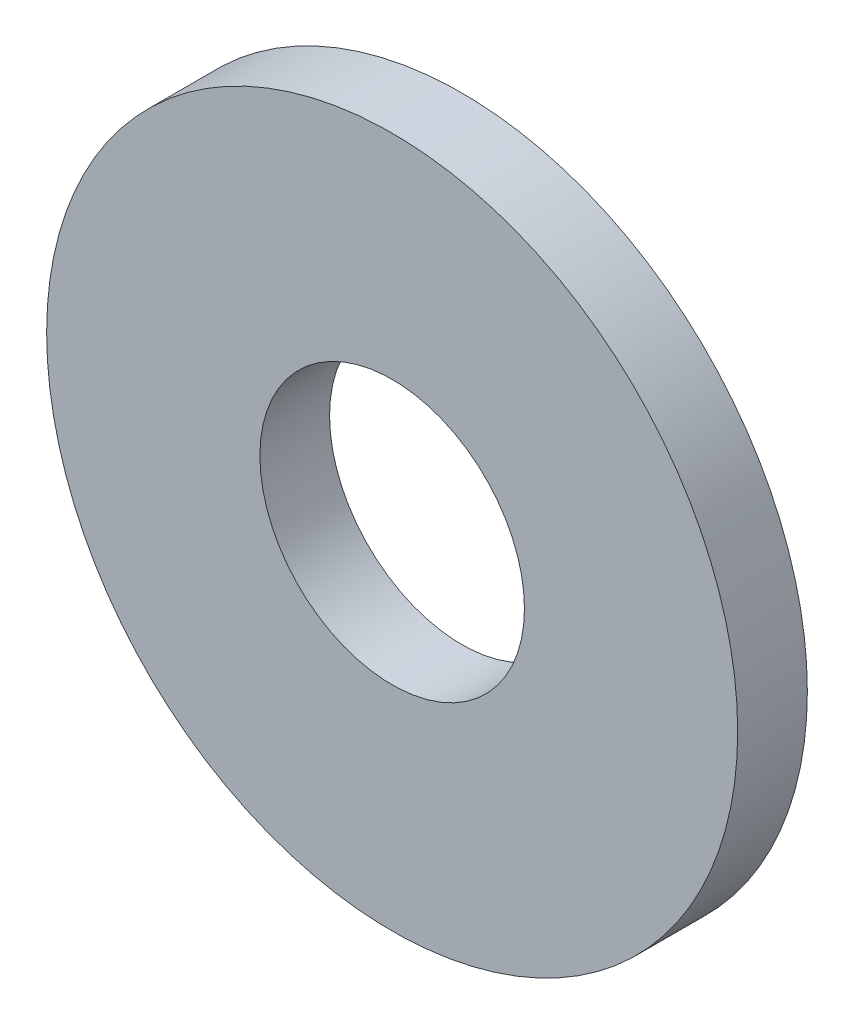
ISO-10303-21;
HEADER;
FILE_DESCRIPTION(('STEP AP214'),'2;1');
FILE_NAME('part.step','',(''),(''),'','','');
FILE_SCHEMA(('AUTOMOTIVE_DESIGN { 1 0 10303 214 1 1 1 1 }'));
ENDSEC;
DATA;
#1=APPLICATION_CONTEXT('core data for automotive mechanical design processes');
#2=APPLICATION_PROTOCOL_DEFINITION('international standard','automotive_design',2000,#1);
#3=PRODUCT_CONTEXT('',#1,'mechanical');
#4=PRODUCT('Part','Part','',(#3));
#5=PRODUCT_RELATED_PRODUCT_CATEGORY('part','',(#4));
#6=PRODUCT_DEFINITION_FORMATION('','',#4);
#7=PRODUCT_DEFINITION_CONTEXT('part definition',#1,'design');
#8=PRODUCT_DEFINITION('design','',#6,#7);
#9=PRODUCT_DEFINITION_SHAPE('','',#8);
#10=(LENGTH_UNIT() NAMED_UNIT(*) SI_UNIT(.MILLI.,.METRE.));
#11=(NAMED_UNIT(*) PLANE_ANGLE_UNIT() SI_UNIT($,.RADIAN.));
#12=(NAMED_UNIT(*) SI_UNIT($,.STERADIAN.) SOLID_ANGLE_UNIT());
#13=UNCERTAINTY_MEASURE_WITH_UNIT(LENGTH_MEASURE(1.E-05),#10,'distance_accuracy_value','');
#14=(GEOMETRIC_REPRESENTATION_CONTEXT(3) GLOBAL_UNCERTAINTY_ASSIGNED_CONTEXT((#13)) GLOBAL_UNIT_ASSIGNED_CONTEXT((#10,
#11,#12)) REPRESENTATION_CONTEXT('',''));
#15=CARTESIAN_POINT('',(0.,0.,0.));
#16=DIRECTION('',(0.,0.,1.));
#17=DIRECTION('',(1.,0.,0.));
#18=AXIS2_PLACEMENT_3D('',#15,#16,#17);
#19=CARTESIAN_POINT('',(0.,0.,0.939799999999998));
#20=DIRECTION('',(0.,0.,1.));
#21=DIRECTION('',(1.,0.,0.));
#22=AXIS2_PLACEMENT_3D('',#19,#20,#21);
#23=PLANE('',#22);
#24=CARTESIAN_POINT('',(0.,0.,0.939799999999998));
#25=DIRECTION('',(0.,0.,1.));
#26=DIRECTION('',(1.,0.,0.));
#27=AXIS2_PLACEMENT_3D('',#24,#25,#26);
#28=CIRCLE('',#27,9.3218);
#29=CARTESIAN_POINT('',(-9.3218,0.,0.939799999999998));
#30=VERTEX_POINT('',#29);
#31=EDGE_CURVE('E10',#30,#30,#28,.T.);
#32=ORIENTED_EDGE('',*,*,#31,.T.);
#33=EDGE_LOOP('',(#32));
#34=FACE_BOUND('',#33,.T.);
#35=CARTESIAN_POINT('',(0.,0.,0.939799999999998));
#36=DIRECTION('',(0.,0.,1.));
#37=DIRECTION('',(1.,0.,0.));
#38=AXIS2_PLACEMENT_3D('',#35,#36,#37);
#39=CIRCLE('',#38,3.5687);
#40=CARTESIAN_POINT('',(-3.5687,0.,0.939799999999998));
#41=VERTEX_POINT('',#40);
#42=EDGE_CURVE('E37',#41,#41,#39,.T.);
#43=ORIENTED_EDGE('',*,*,#42,.F.);
#44=EDGE_LOOP('',(#43));
#45=FACE_BOUND('',#44,.T.);
#46=ADVANCED_FACE('F30',(#34,#45),#23,.T.);
#47=CARTESIAN_POINT('',(0.,0.,0.939799999999998));
#48=DIRECTION('',(0.,0.,-1.));
#49=DIRECTION('',(-1.,0.,0.));
#50=AXIS2_PLACEMENT_3D('',#47,#48,#49);
#51=CYLINDRICAL_SURFACE('',#50,9.3218);
#52=CARTESIAN_POINT('',(0.,0.,-0.939800000000002));
#53=DIRECTION('',(0.,0.,1.));
#54=DIRECTION('',(1.,0.,0.));
#55=AXIS2_PLACEMENT_3D('',#52,#53,#54);
#56=CIRCLE('',#55,9.3218);
#57=CARTESIAN_POINT('',(-9.3218,0.,-0.939800000000002));
#58=VERTEX_POINT('',#57);
#59=EDGE_CURVE('E41',#58,#58,#56,.T.);
#60=CARTESIAN_POINT('',(-9.3218,0.,0.939799999999998));
#61=CARTESIAN_POINT('',(-9.3218,0.,0.920220833333331));
#62=CARTESIAN_POINT('',(-9.3218,0.,0.900641666666665));
#63=CARTESIAN_POINT('',(-9.3218,0.,0.861483333333332));
#64=CARTESIAN_POINT('',(-9.3218,0.,0.841904166666665));
#65=CARTESIAN_POINT('',(-9.3218,0.,0.802745833333331));
#66=CARTESIAN_POINT('',(-9.3218,0.,0.783166666666665));
#67=CARTESIAN_POINT('',(-9.3218,0.,0.744008333333331));
#68=CARTESIAN_POINT('',(-9.3218,0.,0.724429166666665));
#69=CARTESIAN_POINT('',(-9.3218,0.,0.685270833333331));
#70=CARTESIAN_POINT('',(-9.3218,0.,0.665691666666665));
#71=CARTESIAN_POINT('',(-9.3218,0.,0.626533333333331));
#72=CARTESIAN_POINT('',(-9.3218,0.,0.606954166666665));
#73=CARTESIAN_POINT('',(-9.3218,0.,0.567795833333332));
#74=CARTESIAN_POINT('',(-9.3218,0.,0.548216666666665));
#75=CARTESIAN_POINT('',(-9.3218,0.,0.509058333333332));
#76=CARTESIAN_POINT('',(-9.3218,0.,0.489479166666665));
#77=CARTESIAN_POINT('',(-9.3218,0.,0.450320833333331));
#78=CARTESIAN_POINT('',(-9.3218,0.,0.430741666666665));
#79=CARTESIAN_POINT('',(-9.3218,0.,0.391583333333332));
#80=CARTESIAN_POINT('',(-9.3218,0.,0.372004166666665));
#81=CARTESIAN_POINT('',(-9.3218,0.,0.332845833333332));
#82=CARTESIAN_POINT('',(-9.3218,0.,0.313266666666665));
#83=CARTESIAN_POINT('',(-9.3218,0.,0.274108333333332));
#84=CARTESIAN_POINT('',(-9.3218,0.,0.254529166666665));
#85=CARTESIAN_POINT('',(-9.3218,0.,0.215370833333332));
#86=CARTESIAN_POINT('',(-9.3218,0.,0.195791666666665));
#87=CARTESIAN_POINT('',(-9.3218,0.,0.156633333333331));
#88=CARTESIAN_POINT('',(-9.3218,0.,0.137054166666665));
#89=CARTESIAN_POINT('',(-9.3218,0.,0.0978958333333315));
#90=CARTESIAN_POINT('',(-9.3218,0.,0.0783166666666649));
#91=CARTESIAN_POINT('',(-9.3218,0.,0.0391583333333315));
#92=CARTESIAN_POINT('',(-9.3218,0.,0.0195791666666648));
#93=CARTESIAN_POINT('',(-9.3218,0.,-0.0195791666666685));
#94=CARTESIAN_POINT('',(-9.3218,0.,-0.0391583333333351));
#95=CARTESIAN_POINT('',(-9.3218,0.,-0.0783166666666685));
#96=CARTESIAN_POINT('',(-9.3218,0.,-0.0978958333333352));
#97=CARTESIAN_POINT('',(-9.3218,0.,-0.137054166666668));
#98=CARTESIAN_POINT('',(-9.3218,0.,-0.156633333333335));
#99=CARTESIAN_POINT('',(-9.3218,0.,-0.195791666666668));
#100=CARTESIAN_POINT('',(-9.3218,0.,-0.215370833333335));
#101=CARTESIAN_POINT('',(-9.3218,0.,-0.254529166666668));
#102=CARTESIAN_POINT('',(-9.3218,0.,-0.274108333333335));
#103=CARTESIAN_POINT('',(-9.3218,0.,-0.313266666666668));
#104=CARTESIAN_POINT('',(-9.3218,0.,-0.332845833333335));
#105=CARTESIAN_POINT('',(-9.3218,0.,-0.372004166666668));
#106=CARTESIAN_POINT('',(-9.3218,0.,-0.391583333333335));
#107=CARTESIAN_POINT('',(-9.3218,0.,-0.430741666666668));
#108=CARTESIAN_POINT('',(-9.3218,0.,-0.450320833333335));
#109=CARTESIAN_POINT('',(-9.3218,0.,-0.489479166666669));
#110=CARTESIAN_POINT('',(-9.3218,0.,-0.509058333333335));
#111=CARTESIAN_POINT('',(-9.3218,0.,-0.548216666666669));
#112=CARTESIAN_POINT('',(-9.3218,0.,-0.567795833333335));
#113=CARTESIAN_POINT('',(-9.3218,0.,-0.606954166666669));
#114=CARTESIAN_POINT('',(-9.3218,0.,-0.626533333333335));
#115=CARTESIAN_POINT('',(-9.3218,0.,-0.665691666666669));
#116=CARTESIAN_POINT('',(-9.3218,0.,-0.685270833333335));
#117=CARTESIAN_POINT('',(-9.3218,0.,-0.724429166666669));
#118=CARTESIAN_POINT('',(-9.3218,0.,-0.744008333333335));
#119=CARTESIAN_POINT('',(-9.3218,0.,-0.783166666666669));
#120=CARTESIAN_POINT('',(-9.3218,0.,-0.802745833333335));
#121=CARTESIAN_POINT('',(-9.3218,0.,-0.841904166666669));
#122=CARTESIAN_POINT('',(-9.3218,0.,-0.861483333333335));
#123=CARTESIAN_POINT('',(-9.3218,0.,-0.900641666666669));
#124=CARTESIAN_POINT('',(-9.3218,0.,-0.920220833333335));
#125=CARTESIAN_POINT('',(-9.3218,0.,-0.939800000000002));
#126=B_SPLINE_CURVE_WITH_KNOTS('',3,(#60,#61,#62,#63,#64,#65,#66,#67,#68,#69,#70,#71,#72,#73,
#74,#75,#76,#77,#78,#79,#80,#81,#82,#83,#84,#85,#86,#87,#88,#89,#90,#91,#92,#93,#94,#95,#96,#97,
#98,#99,#100,#101,#102,#103,#104,#105,#106,#107,#108,#109,#110,#111,#112,#113,#114,#115,#116,
#117,#118,#119,#120,#121,#122,#123,#124,#125),.UNSPECIFIED.,.F.,.F.,(4,2,2,2,2,2,2,2,2,2,2,2,2,
2,2,2,2,2,2,2,2,2,2,2,2,2,2,2,2,2,2,2,4),(0.,0.0587375000000001,0.117475,0.1762125,0.23495,
0.2936875,0.352425,0.4111625,0.4699,0.5286375,0.587375,0.6461125,0.70485,0.7635875,0.822325,
0.8810625,0.9398,0.9985375,1.057275,1.1160125,1.17475,1.2334875,1.292225,1.3509625,1.4097,
1.4684375,1.527175,1.5859125,1.64465,1.7033875,1.762125,1.8208625,1.8796),.UNSPECIFIED.);
#127=EDGE_CURVE('BSEAM32',#30,#58,#126,.T.);
#128=ORIENTED_EDGE('',*,*,#31,.F.);
#129=ORIENTED_EDGE('',*,*,#59,.T.);
#130=ORIENTED_EDGE('',*,*,#127,.T.);
#131=ORIENTED_EDGE('',*,*,#127,.F.);
#132=EDGE_LOOP('',(#128,#130,#129,#131));
#133=FACE_BOUND('',#132,.T.);
#134=ADVANCED_FACE('F32',(#133),#51,.T.);
#135=CARTESIAN_POINT('',(0.,0.,0.939799999999998));
#136=DIRECTION('',(0.,0.,-1.));
#137=DIRECTION('',(-1.,0.,0.));
#138=AXIS2_PLACEMENT_3D('',#135,#136,#137);
#139=CYLINDRICAL_SURFACE('',#138,3.5687);
#140=CARTESIAN_POINT('',(0.,0.,-0.939800000000002));
#141=DIRECTION('',(0.,0.,1.));
#142=DIRECTION('',(1.,0.,0.));
#143=AXIS2_PLACEMENT_3D('',#140,#141,#142);
#144=CIRCLE('',#143,3.5687);
#145=CARTESIAN_POINT('',(-3.5687,0.,-0.939800000000002));
#146=VERTEX_POINT('',#145);
#147=EDGE_CURVE('E45',#146,#146,#144,.T.);
#148=CARTESIAN_POINT('',(-3.5687,0.,0.939799999999998));
#149=CARTESIAN_POINT('',(-3.5687,0.,0.920220833333331));
#150=CARTESIAN_POINT('',(-3.5687,0.,0.900641666666665));
#151=CARTESIAN_POINT('',(-3.5687,0.,0.861483333333332));
#152=CARTESIAN_POINT('',(-3.5687,0.,0.841904166666665));
#153=CARTESIAN_POINT('',(-3.5687,0.,0.802745833333331));
#154=CARTESIAN_POINT('',(-3.5687,0.,0.783166666666665));
#155=CARTESIAN_POINT('',(-3.5687,0.,0.744008333333331));
#156=CARTESIAN_POINT('',(-3.5687,0.,0.724429166666665));
#157=CARTESIAN_POINT('',(-3.5687,0.,0.685270833333331));
#158=CARTESIAN_POINT('',(-3.5687,0.,0.665691666666665));
#159=CARTESIAN_POINT('',(-3.5687,0.,0.626533333333331));
#160=CARTESIAN_POINT('',(-3.5687,0.,0.606954166666665));
#161=CARTESIAN_POINT('',(-3.5687,0.,0.567795833333332));
#162=CARTESIAN_POINT('',(-3.5687,0.,0.548216666666665));
#163=CARTESIAN_POINT('',(-3.5687,0.,0.509058333333332));
#164=CARTESIAN_POINT('',(-3.5687,0.,0.489479166666665));
#165=CARTESIAN_POINT('',(-3.5687,0.,0.450320833333331));
#166=CARTESIAN_POINT('',(-3.5687,0.,0.430741666666665));
#167=CARTESIAN_POINT('',(-3.5687,0.,0.391583333333331));
#168=CARTESIAN_POINT('',(-3.5687,0.,0.372004166666665));
#169=CARTESIAN_POINT('',(-3.5687,0.,0.332845833333332));
#170=CARTESIAN_POINT('',(-3.5687,0.,0.313266666666665));
#171=CARTESIAN_POINT('',(-3.5687,0.,0.274108333333331));
#172=CARTESIAN_POINT('',(-3.5687,0.,0.254529166666665));
#173=CARTESIAN_POINT('',(-3.5687,0.,0.215370833333331));
#174=CARTESIAN_POINT('',(-3.5687,0.,0.195791666666665));
#175=CARTESIAN_POINT('',(-3.5687,0.,0.156633333333331));
#176=CARTESIAN_POINT('',(-3.5687,0.,0.137054166666665));
#177=CARTESIAN_POINT('',(-3.5687,0.,0.0978958333333314));
#178=CARTESIAN_POINT('',(-3.5687,0.,0.0783166666666648));
#179=CARTESIAN_POINT('',(-3.5687,0.,0.0391583333333314));
#180=CARTESIAN_POINT('',(-3.5687,0.,0.0195791666666647));
#181=CARTESIAN_POINT('',(-3.5687,0.,-0.0195791666666686));
#182=CARTESIAN_POINT('',(-3.5687,0.,-0.0391583333333352));
#183=CARTESIAN_POINT('',(-3.5687,0.,-0.0783166666666685));
#184=CARTESIAN_POINT('',(-3.5687,0.,-0.0978958333333352));
#185=CARTESIAN_POINT('',(-3.5687,0.,-0.137054166666668));
#186=CARTESIAN_POINT('',(-3.5687,0.,-0.156633333333335));
#187=CARTESIAN_POINT('',(-3.5687,0.,-0.195791666666668));
#188=CARTESIAN_POINT('',(-3.5687,0.,-0.215370833333335));
#189=CARTESIAN_POINT('',(-3.5687,0.,-0.254529166666668));
#190=CARTESIAN_POINT('',(-3.5687,0.,-0.274108333333335));
#191=CARTESIAN_POINT('',(-3.5687,0.,-0.313266666666668));
#192=CARTESIAN_POINT('',(-3.5687,0.,-0.332845833333335));
#193=CARTESIAN_POINT('',(-3.5687,0.,-0.372004166666668));
#194=CARTESIAN_POINT('',(-3.5687,0.,-0.391583333333335));
#195=CARTESIAN_POINT('',(-3.5687,0.,-0.430741666666668));
#196=CARTESIAN_POINT('',(-3.5687,0.,-0.450320833333335));
#197=CARTESIAN_POINT('',(-3.5687,0.,-0.489479166666669));
#198=CARTESIAN_POINT('',(-3.5687,0.,-0.509058333333335));
#199=CARTESIAN_POINT('',(-3.5687,0.,-0.548216666666669));
#200=CARTESIAN_POINT('',(-3.5687,0.,-0.567795833333335));
#201=CARTESIAN_POINT('',(-3.5687,0.,-0.606954166666669));
#202=CARTESIAN_POINT('',(-3.5687,0.,-0.626533333333335));
#203=CARTESIAN_POINT('',(-3.5687,0.,-0.665691666666669));
#204=CARTESIAN_POINT('',(-3.5687,0.,-0.685270833333335));
#205=CARTESIAN_POINT('',(-3.5687,0.,-0.724429166666669));
#206=CARTESIAN_POINT('',(-3.5687,0.,-0.744008333333335));
#207=CARTESIAN_POINT('',(-3.5687,0.,-0.783166666666669));
#208=CARTESIAN_POINT('',(-3.5687,0.,-0.802745833333335));
#209=CARTESIAN_POINT('',(-3.5687,0.,-0.841904166666669));
#210=CARTESIAN_POINT('',(-3.5687,0.,-0.861483333333335));
#211=CARTESIAN_POINT('',(-3.5687,0.,-0.900641666666669));
#212=CARTESIAN_POINT('',(-3.5687,0.,-0.920220833333335));
#213=CARTESIAN_POINT('',(-3.5687,0.,-0.939800000000002));
#214=B_SPLINE_CURVE_WITH_KNOTS('',3,(#148,#149,#150,#151,#152,#153,#154,#155,#156,#157,#158,
#159,#160,#161,#162,#163,#164,#165,#166,#167,#168,#169,#170,#171,#172,#173,#174,#175,#176,#177,
#178,#179,#180,#181,#182,#183,#184,#185,#186,#187,#188,#189,#190,#191,#192,#193,#194,#195,#196,
#197,#198,#199,#200,#201,#202,#203,#204,#205,#206,#207,#208,#209,#210,#211,#212,#213),
.UNSPECIFIED.,.F.,.F.,(4,2,2,2,2,2,2,2,2,2,2,2,2,2,2,2,2,2,2,2,2,2,2,2,2,2,2,2,2,2,2,2,4),(0.,
0.0587375,0.117475,0.1762125,0.23495,0.2936875,0.352425,0.4111625,0.4699,0.5286375,0.587375,
0.6461125,0.70485,0.7635875,0.822325,0.8810625,0.9398,0.9985375,1.057275,1.1160125,1.17475,
1.2334875,1.292225,1.3509625,1.4097,1.4684375,1.527175,1.5859125,1.64465,1.7033875,1.762125,
1.8208625,1.8796),.UNSPECIFIED.);
#215=EDGE_CURVE('BSEAM54',#41,#146,#214,.T.);
#216=ORIENTED_EDGE('',*,*,#42,.T.);
#217=ORIENTED_EDGE('',*,*,#147,.F.);
#218=ORIENTED_EDGE('',*,*,#215,.T.);
#219=ORIENTED_EDGE('',*,*,#215,.F.);
#220=EDGE_LOOP('',(#216,#218,#217,#219));
#221=FACE_BOUND('',#220,.T.);
#222=ADVANCED_FACE('F54',(#221),#139,.F.);
#223=CARTESIAN_POINT('',(0.,0.,-0.939800000000002));
#224=DIRECTION('',(0.,0.,1.));
#225=DIRECTION('',(1.,0.,0.));
#226=AXIS2_PLACEMENT_3D('',#223,#224,#225);
#227=PLANE('',#226);
#228=ORIENTED_EDGE('',*,*,#147,.T.);
#229=EDGE_LOOP('',(#228));
#230=FACE_BOUND('',#229,.T.);
#231=ORIENTED_EDGE('',*,*,#59,.F.);
#232=EDGE_LOOP('',(#231));
#233=FACE_BOUND('',#232,.T.);
#234=ADVANCED_FACE('F51',(#230,#233),#227,.F.);
#235=CLOSED_SHELL('',(#46,#134,#222,#234));
#236=MANIFOLD_SOLID_BREP('B2',#235);
#237=ADVANCED_BREP_SHAPE_REPRESENTATION('',(#18,#236),#14);
#238=SHAPE_DEFINITION_REPRESENTATION(#9,#237);
ENDSEC;
END-ISO-10303-21;
